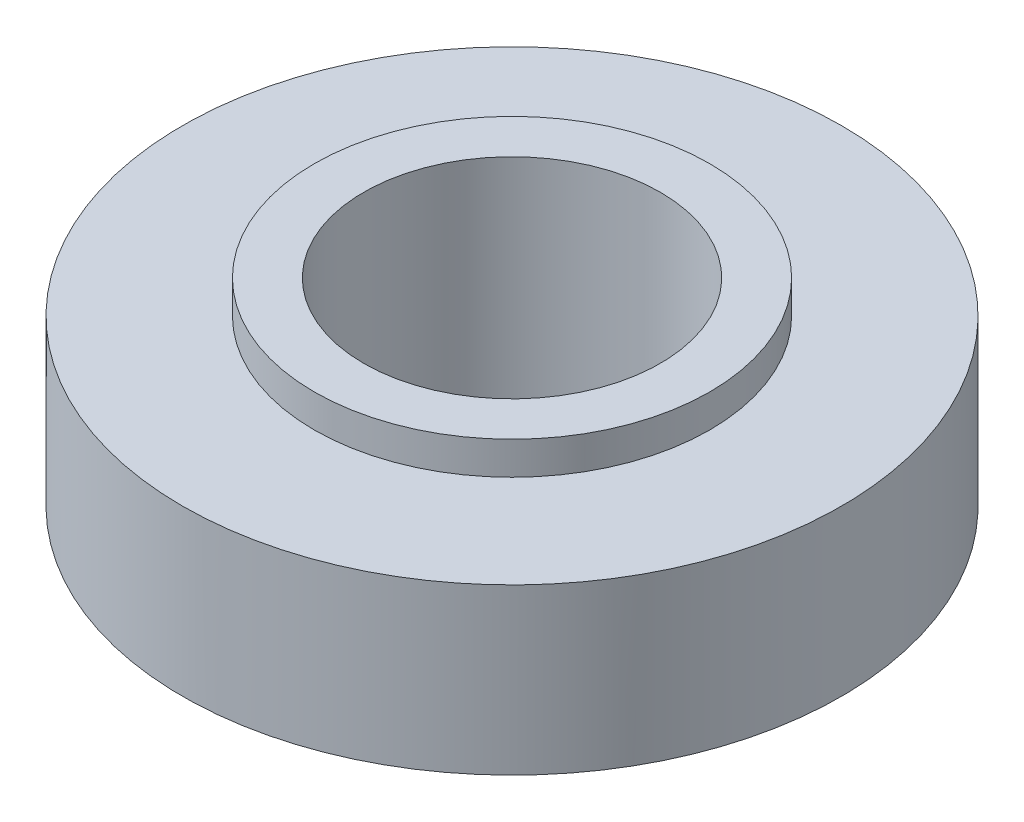
ISO-10303-21;
HEADER;
FILE_DESCRIPTION(('STEP AP214'),'2;1');
FILE_NAME('part.step','',(''),(''),'','','');
FILE_SCHEMA(('AUTOMOTIVE_DESIGN { 1 0 10303 214 1 1 1 1 }'));
ENDSEC;
DATA;
#1=APPLICATION_CONTEXT('core data for automotive mechanical design processes');
#2=APPLICATION_PROTOCOL_DEFINITION('international standard','automotive_design',2000,#1);
#3=PRODUCT_CONTEXT('',#1,'mechanical');
#4=PRODUCT('Part','Part','',(#3));
#5=PRODUCT_RELATED_PRODUCT_CATEGORY('part','',(#4));
#6=PRODUCT_DEFINITION_FORMATION('','',#4);
#7=PRODUCT_DEFINITION_CONTEXT('part definition',#1,'design');
#8=PRODUCT_DEFINITION('design','',#6,#7);
#9=PRODUCT_DEFINITION_SHAPE('','',#8);
#10=(LENGTH_UNIT() NAMED_UNIT(*) SI_UNIT(.MILLI.,.METRE.));
#11=(NAMED_UNIT(*) PLANE_ANGLE_UNIT() SI_UNIT($,.RADIAN.));
#12=(NAMED_UNIT(*) SI_UNIT($,.STERADIAN.) SOLID_ANGLE_UNIT());
#13=UNCERTAINTY_MEASURE_WITH_UNIT(LENGTH_MEASURE(1.E-05),#10,'distance_accuracy_value','');
#14=(GEOMETRIC_REPRESENTATION_CONTEXT(3) GLOBAL_UNCERTAINTY_ASSIGNED_CONTEXT((#13)) GLOBAL_UNIT_ASSIGNED_CONTEXT((#10,
#11,#12)) REPRESENTATION_CONTEXT('',''));
#15=CARTESIAN_POINT('',(0.,0.,0.));
#16=DIRECTION('',(0.,0.,1.));
#17=DIRECTION('',(1.,0.,0.));
#18=AXIS2_PLACEMENT_3D('',#15,#16,#17);
#19=CARTESIAN_POINT('',(0.,3.5,0.));
#20=DIRECTION('',(0.,-1.,0.));
#21=DIRECTION('',(0.,0.,-1.));
#22=AXIS2_PLACEMENT_3D('',#19,#20,#21);
#23=CYLINDRICAL_SURFACE('',#22,10.);
#24=CARTESIAN_POINT('',(0.,2.5,0.));
#25=DIRECTION('',(0.,1.,0.));
#26=DIRECTION('',(0.,0.,1.));
#27=AXIS2_PLACEMENT_3D('',#24,#25,#26);
#28=CIRCLE('',#27,10.);
#29=CARTESIAN_POINT('',(0.,2.5,10.));
#30=VERTEX_POINT('',#29);
#31=EDGE_CURVE('E47',#30,#30,#28,.T.);
#32=ORIENTED_EDGE('',*,*,#31,.F.);
#33=EDGE_LOOP('',(#32));
#34=FACE_BOUND('',#33,.T.);
#35=CARTESIAN_POINT('',(0.,-2.5,0.));
#36=DIRECTION('',(0.,-1.,0.));
#37=DIRECTION('',(0.,0.,-1.));
#38=AXIS2_PLACEMENT_3D('',#35,#36,#37);
#39=CIRCLE('',#38,10.);
#40=CARTESIAN_POINT('',(0.,-2.5,-10.));
#41=VERTEX_POINT('',#40);
#42=EDGE_CURVE('E38',#41,#41,#39,.T.);
#43=ORIENTED_EDGE('',*,*,#42,.F.);
#44=EDGE_LOOP('',(#43));
#45=FACE_BOUND('',#44,.T.);
#46=ADVANCED_FACE('F35',(#34,#45),#23,.T.);
#47=CARTESIAN_POINT('',(0.,-3.5,0.));
#48=DIRECTION('',(0.,1.,0.));
#49=DIRECTION('',(0.,0.,1.));
#50=AXIS2_PLACEMENT_3D('',#47,#48,#49);
#51=PLANE('',#50);
#52=CARTESIAN_POINT('',(0.,-3.5,0.));
#53=DIRECTION('',(0.,1.,0.));
#54=DIRECTION('',(0.,0.,1.));
#55=AXIS2_PLACEMENT_3D('',#52,#53,#54);
#56=CIRCLE('',#55,4.5);
#57=CARTESIAN_POINT('',(0.,-3.5,4.5));
#58=VERTEX_POINT('',#57);
#59=EDGE_CURVE('E42',#58,#58,#56,.T.);
#60=ORIENTED_EDGE('',*,*,#59,.T.);
#61=EDGE_LOOP('',(#60));
#62=FACE_BOUND('',#61,.T.);
#63=CARTESIAN_POINT('',(0.,-3.5,0.));
#64=DIRECTION('',(0.,1.,0.));
#65=DIRECTION('',(0.,0.,1.));
#66=AXIS2_PLACEMENT_3D('',#63,#64,#65);
#67=CIRCLE('',#66,6.);
#68=CARTESIAN_POINT('',(0.,-3.5,6.));
#69=VERTEX_POINT('',#68);
#70=EDGE_CURVE('E61',#69,#69,#67,.T.);
#71=ORIENTED_EDGE('',*,*,#70,.F.);
#72=EDGE_LOOP('',(#71));
#73=FACE_BOUND('',#72,.T.);
#74=ADVANCED_FACE('F74',(#62,#73),#51,.F.);
#75=CARTESIAN_POINT('',(0.,3.5,0.));
#76=DIRECTION('',(0.,1.,0.));
#77=DIRECTION('',(0.,0.,1.));
#78=AXIS2_PLACEMENT_3D('',#75,#76,#77);
#79=PLANE('',#78);
#80=CARTESIAN_POINT('',(0.,3.5,0.));
#81=DIRECTION('',(0.,1.,0.));
#82=DIRECTION('',(0.,0.,1.));
#83=AXIS2_PLACEMENT_3D('',#80,#81,#82);
#84=CIRCLE('',#83,4.5);
#85=CARTESIAN_POINT('',(0.,3.5,4.5));
#86=VERTEX_POINT('',#85);
#87=EDGE_CURVE('E10',#86,#86,#84,.T.);
#88=ORIENTED_EDGE('',*,*,#87,.F.);
#89=EDGE_LOOP('',(#88));
#90=FACE_BOUND('',#89,.T.);
#91=CARTESIAN_POINT('',(0.,3.5,0.));
#92=DIRECTION('',(0.,1.,0.));
#93=DIRECTION('',(0.,0.,1.));
#94=AXIS2_PLACEMENT_3D('',#91,#92,#93);
#95=CIRCLE('',#94,6.);
#96=CARTESIAN_POINT('',(0.,3.5,6.));
#97=VERTEX_POINT('',#96);
#98=EDGE_CURVE('E50',#97,#97,#95,.T.);
#99=ORIENTED_EDGE('',*,*,#98,.T.);
#100=EDGE_LOOP('',(#99));
#101=FACE_BOUND('',#100,.T.);
#102=ADVANCED_FACE('F79',(#90,#101),#79,.T.);
#103=CARTESIAN_POINT('',(0.,3.5,0.));
#104=DIRECTION('',(0.,-1.,0.));
#105=DIRECTION('',(0.,0.,-1.));
#106=AXIS2_PLACEMENT_3D('',#103,#104,#105);
#107=CYLINDRICAL_SURFACE('',#106,4.5);
#108=ORIENTED_EDGE('',*,*,#87,.T.);
#109=EDGE_LOOP('',(#108));
#110=FACE_BOUND('',#109,.T.);
#111=ORIENTED_EDGE('',*,*,#59,.F.);
#112=EDGE_LOOP('',(#111));
#113=FACE_BOUND('',#112,.T.);
#114=ADVANCED_FACE('F84',(#110,#113),#107,.F.);
#115=CARTESIAN_POINT('',(0.,2.5,0.));
#116=DIRECTION('',(0.,1.,0.));
#117=DIRECTION('',(0.,0.,1.));
#118=AXIS2_PLACEMENT_3D('',#115,#116,#117);
#119=PLANE('',#118);
#120=CARTESIAN_POINT('',(0.,2.5,0.));
#121=DIRECTION('',(0.,1.,0.));
#122=DIRECTION('',(0.,0.,1.));
#123=AXIS2_PLACEMENT_3D('',#120,#121,#122);
#124=CIRCLE('',#123,6.);
#125=CARTESIAN_POINT('',(0.,2.5,6.));
#126=VERTEX_POINT('',#125);
#127=EDGE_CURVE('E53',#126,#126,#124,.T.);
#128=ORIENTED_EDGE('',*,*,#127,.F.);
#129=EDGE_LOOP('',(#128));
#130=FACE_BOUND('',#129,.T.);
#131=ORIENTED_EDGE('',*,*,#31,.T.);
#132=EDGE_LOOP('',(#131));
#133=FACE_BOUND('',#132,.T.);
#134=ADVANCED_FACE('F91',(#130,#133),#119,.T.);
#135=CARTESIAN_POINT('',(0.,2.5,0.));
#136=DIRECTION('',(0.,1.,0.));
#137=DIRECTION('',(0.,0.,1.));
#138=AXIS2_PLACEMENT_3D('',#135,#136,#137);
#139=CYLINDRICAL_SURFACE('',#138,6.);
#140=ORIENTED_EDGE('',*,*,#127,.T.);
#141=EDGE_LOOP('',(#140));
#142=FACE_BOUND('',#141,.T.);
#143=ORIENTED_EDGE('',*,*,#98,.F.);
#144=EDGE_LOOP('',(#143));
#145=FACE_BOUND('',#144,.T.);
#146=ADVANCED_FACE('F94',(#142,#145),#139,.T.);
#147=CARTESIAN_POINT('',(0.,-2.5,0.));
#148=DIRECTION('',(0.,-1.,0.));
#149=DIRECTION('',(0.,0.,1.));
#150=AXIS2_PLACEMENT_3D('',#147,#148,#149);
#151=PLANE('',#150);
#152=CARTESIAN_POINT('',(0.,-2.5,0.));
#153=DIRECTION('',(0.,1.,0.));
#154=DIRECTION('',(0.,0.,1.));
#155=AXIS2_PLACEMENT_3D('',#152,#153,#154);
#156=CIRCLE('',#155,6.);
#157=CARTESIAN_POINT('',(0.,-2.5,6.));
#158=VERTEX_POINT('',#157);
#159=EDGE_CURVE('E64',#158,#158,#156,.T.);
#160=ORIENTED_EDGE('',*,*,#159,.T.);
#161=EDGE_LOOP('',(#160));
#162=FACE_BOUND('',#161,.T.);
#163=ORIENTED_EDGE('',*,*,#42,.T.);
#164=EDGE_LOOP('',(#163));
#165=FACE_BOUND('',#164,.T.);
#166=ADVANCED_FACE('F71',(#162,#165),#151,.T.);
#167=CARTESIAN_POINT('',(0.,-2.5,0.));
#168=DIRECTION('',(0.,-1.,0.));
#169=DIRECTION('',(0.,0.,-1.));
#170=AXIS2_PLACEMENT_3D('',#167,#168,#169);
#171=CYLINDRICAL_SURFACE('',#170,6.);
#172=ORIENTED_EDGE('',*,*,#159,.F.);
#173=EDGE_LOOP('',(#172));
#174=FACE_BOUND('',#173,.T.);
#175=ORIENTED_EDGE('',*,*,#70,.T.);
#176=EDGE_LOOP('',(#175));
#177=FACE_BOUND('',#176,.T.);
#178=ADVANCED_FACE('F100',(#174,#177),#171,.T.);
#179=CLOSED_SHELL('',(#46,#74,#102,#114,#134,#146,#166,#178));
#180=MANIFOLD_SOLID_BREP('B2',#179);
#181=ADVANCED_BREP_SHAPE_REPRESENTATION('',(#18,#180),#14);
#182=SHAPE_DEFINITION_REPRESENTATION(#9,#181);
ENDSEC;
END-ISO-10303-21;
